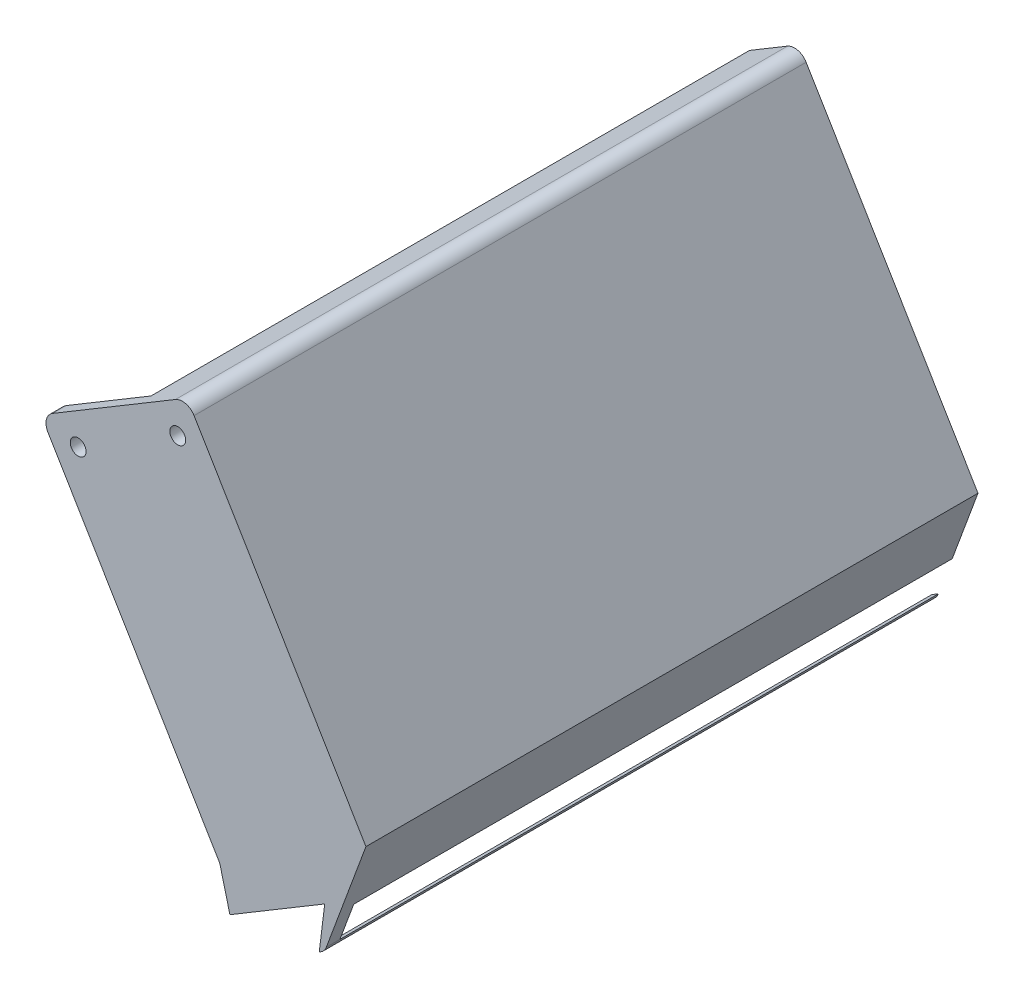
ISO-10303-21;
HEADER;
FILE_DESCRIPTION(('STEP AP214'),'2;1');
FILE_NAME('part.step','',(''),(''),'','','');
FILE_SCHEMA(('AUTOMOTIVE_DESIGN { 1 0 10303 214 1 1 1 1 }'));
ENDSEC;
DATA;
#1=APPLICATION_CONTEXT('core data for automotive mechanical design processes');
#2=APPLICATION_PROTOCOL_DEFINITION('international standard','automotive_design',2000,#1);
#3=PRODUCT_CONTEXT('',#1,'mechanical');
#4=PRODUCT('Part','Part','',(#3));
#5=PRODUCT_RELATED_PRODUCT_CATEGORY('part','',(#4));
#6=PRODUCT_DEFINITION_FORMATION('','',#4);
#7=PRODUCT_DEFINITION_CONTEXT('part definition',#1,'design');
#8=PRODUCT_DEFINITION('design','',#6,#7);
#9=PRODUCT_DEFINITION_SHAPE('','',#8);
#10=(LENGTH_UNIT() NAMED_UNIT(*) SI_UNIT(.MILLI.,.METRE.));
#11=(NAMED_UNIT(*) PLANE_ANGLE_UNIT() SI_UNIT($,.RADIAN.));
#12=(NAMED_UNIT(*) SI_UNIT($,.STERADIAN.) SOLID_ANGLE_UNIT());
#13=UNCERTAINTY_MEASURE_WITH_UNIT(LENGTH_MEASURE(1.E-05),#10,'distance_accuracy_value','');
#14=(GEOMETRIC_REPRESENTATION_CONTEXT(3) GLOBAL_UNCERTAINTY_ASSIGNED_CONTEXT((#13)) GLOBAL_UNIT_ASSIGNED_CONTEXT((#10,
#11,#12)) REPRESENTATION_CONTEXT('',''));
#15=CARTESIAN_POINT('',(0.,0.,0.));
#16=DIRECTION('',(0.,0.,1.));
#17=DIRECTION('',(1.,0.,0.));
#18=AXIS2_PLACEMENT_3D('',#15,#16,#17);
#19=CARTESIAN_POINT('',(0.,0.,0.));
#20=DIRECTION('',(0.,0.,1.));
#21=DIRECTION('',(1.,0.,0.));
#22=AXIS2_PLACEMENT_3D('',#19,#20,#21);
#23=PLANE('',#22);
#24=DIRECTION('',(-0.122168218425157,-0.992509408724584,0.));
#25=VECTOR('',#24,1.);
#26=CARTESIAN_POINT('',(-24.1589217394589,2.97372740453434,0.));
#27=LINE('',#26,#25);
#28=CARTESIAN_POINT('',(-18.5911401472742,48.2070596672311,0.));
#29=VERTEX_POINT('',#28);
#30=CARTESIAN_POINT('',(-18.6908477215663,47.3970232528373,0.));
#31=VERTEX_POINT('',#30);
#32=EDGE_CURVE('E155',#29,#31,#27,.T.);
#33=ORIENTED_EDGE('',*,*,#32,.F.);
#34=DIRECTION('',(0.85819225027226,0.513328414928139,0.));
#35=VECTOR('',#34,1.);
#36=CARTESIAN_POINT('',(-26.1357494823267,43.6942452599861,0.));
#37=LINE('',#36,#35);
#38=CARTESIAN_POINT('',(-17.1299721020068,49.0810585601164,0.));
#39=VERTEX_POINT('',#38);
#40=EDGE_CURVE('E287',#29,#39,#37,.T.);
#41=ORIENTED_EDGE('',*,*,#40,.T.);
#42=CARTESIAN_POINT('',(-19.9431684758562,50.1231363701482,0.));
#43=DIRECTION('',(0.,0.,1.));
#44=DIRECTION('',(1.,0.,0.));
#45=AXIS2_PLACEMENT_3D('',#42,#43,#44);
#46=CIRCLE('',#45,3.);
#47=EDGE_CURVE('E158',#31,#39,#46,.T.);
#48=ORIENTED_EDGE('',*,*,#47,.F.);
#49=EDGE_LOOP('',(#33,#41,#48));
#50=FACE_BOUND('',#49,.T.);
#51=ADVANCED_FACE('F41',(#50),#23,.F.);
#52=CARTESIAN_POINT('',(-49.9700560209885,130.572534582023,252.162501477807));
#53=DIRECTION('',(0.,0.,-1.));
#54=DIRECTION('',(-1.,0.,0.));
#55=AXIS2_PLACEMENT_3D('',#52,#53,#54);
#56=CYLINDRICAL_SURFACE('',#55,1.75);
#57=CARTESIAN_POINT('',(-49.9700560209885,130.572534582023,135.29379279844));
#58=DIRECTION('',(-5.48544119584451E-13,9.16846114590286E-13,-1.));
#59=DIRECTION('',(0.,1.,9.16846114590286E-13));
#60=AXIS2_PLACEMENT_3D('',#57,#58,#59);
#61=CIRCLE('',#60,1.75);
#62=CARTESIAN_POINT('',(-49.9700560209885,132.322534582023,135.293792798442));
#63=VERTEX_POINT('',#62);
#64=EDGE_CURVE('E141',#63,#63,#61,.T.);
#65=ORIENTED_EDGE('',*,*,#64,.F.);
#66=EDGE_LOOP('',(#65));
#67=FACE_BOUND('',#66,.T.);
#68=CARTESIAN_POINT('',(-49.9700560209885,130.572534582023,0.));
#69=DIRECTION('',(0.,0.,1.));
#70=DIRECTION('',(1.,0.,0.));
#71=AXIS2_PLACEMENT_3D('',#68,#69,#70);
#72=CIRCLE('',#71,1.75);
#73=CARTESIAN_POINT('',(-48.2200560209885,130.572534582023,0.));
#74=VERTEX_POINT('',#73);
#75=EDGE_CURVE('E148',#74,#74,#72,.T.);
#76=ORIENTED_EDGE('',*,*,#75,.F.);
#77=EDGE_LOOP('',(#76));
#78=FACE_BOUND('',#77,.T.);
#79=ADVANCED_FACE('F315',(#67,#78),#56,.F.);
#80=CARTESIAN_POINT('',(-71.983811387942,117.404597068063,252.162501477807));
#81=DIRECTION('',(0.,0.,-1.));
#82=DIRECTION('',(-1.,0.,0.));
#83=AXIS2_PLACEMENT_3D('',#80,#81,#82);
#84=CYLINDRICAL_SURFACE('',#83,1.74999999999394);
#85=CARTESIAN_POINT('',(-71.983811387942,117.404597068063,132.293792798428));
#86=DIRECTION('',(0.,0.,1.));
#87=DIRECTION('',(0.,-1.,0.));
#88=AXIS2_PLACEMENT_3D('',#85,#86,#87);
#89=CIRCLE('',#88,1.74999999999394);
#90=CARTESIAN_POINT('',(-71.983811387942,115.654597068069,132.293792798428));
#91=VERTEX_POINT('',#90);
#92=EDGE_CURVE('E273',#91,#91,#89,.T.);
#93=ORIENTED_EDGE('',*,*,#92,.F.);
#94=EDGE_LOOP('',(#93));
#95=FACE_BOUND('',#94,.T.);
#96=CARTESIAN_POINT('',(-71.983811387942,117.404597068063,135.29379279844));
#97=DIRECTION('',(-5.48544119584451E-13,9.16846114590286E-13,-1.));
#98=DIRECTION('',(0.,1.,9.16846114590286E-13));
#99=AXIS2_PLACEMENT_3D('',#96,#97,#98);
#100=CIRCLE('',#99,1.74999999999394);
#101=CARTESIAN_POINT('',(-71.983811387942,119.154597068057,135.293792798442));
#102=VERTEX_POINT('',#101);
#103=EDGE_CURVE('E142',#102,#102,#100,.T.);
#104=ORIENTED_EDGE('',*,*,#103,.F.);
#105=EDGE_LOOP('',(#104));
#106=FACE_BOUND('',#105,.T.);
#107=ADVANCED_FACE('F43',(#95,#106),#84,.F.);
#108=ORIENTED_EDGE('',*,*,#75,.T.);
#109=EDGE_LOOP('',(#108));
#110=FACE_BOUND('',#109,.T.);
#111=DIRECTION('',(-0.347359270010605,-0.93773212461646,0.));
#112=VECTOR('',#111,1.);
#113=CARTESIAN_POINT('',(-31.0502665739293,11.5017899543179,0.));
#114=LINE('',#113,#112);
#115=CARTESIAN_POINT('',(-8.37331814381061,72.7205477854932,0.));
#116=VERTEX_POINT('',#115);
#117=CARTESIAN_POINT('',(-14.0762914229905,57.3247840577743,0.));
#118=VERTEX_POINT('',#117);
#119=EDGE_CURVE('E161',#116,#118,#114,.T.);
#120=ORIENTED_EDGE('',*,*,#119,.T.);
#121=DIRECTION('',(-0.513328414928139,0.85819225027226,0.));
#122=VECTOR('',#121,1.);
#123=CARTESIAN_POINT('',(14.8864399129308,8.90433653065903,0.));
#124=LINE('',#123,#122);
#125=CARTESIAN_POINT('',(-58.8825995643649,132.232825950646,0.));
#126=VERTEX_POINT('',#125);
#127=EDGE_CURVE('E253',#118,#126,#124,.T.);
#128=ORIENTED_EDGE('',*,*,#127,.T.);
#129=DIRECTION('',(-0.858185530746527,-0.513339648592724,0.));
#130=VECTOR('',#129,1.);
#131=CARTESIAN_POINT('',(-73.7705372705339,123.327328903047,0.));
#132=LINE('',#131,#130);
#133=CARTESIAN_POINT('',(-50.4755373203077,137.261666712279,0.));
#134=VERTEX_POINT('',#133);
#135=EDGE_CURVE('E151',#134,#126,#132,.T.);
#136=ORIENTED_EDGE('',*,*,#135,.F.);
#137=CARTESIAN_POINT('',(-48.9355183745295,134.687110120039,0.));
#138=DIRECTION('',(0.,0.,1.));
#139=DIRECTION('',(1.,0.,0.));
#140=AXIS2_PLACEMENT_3D('',#137,#138,#139);
#141=CIRCLE('',#140,3.);
#142=CARTESIAN_POINT('',(-46.3609617822885,136.227129065815,0.));
#143=VERTEX_POINT('',#142);
#144=EDGE_CURVE('E167',#143,#134,#141,.T.);
#145=ORIENTED_EDGE('',*,*,#144,.F.);
#146=DIRECTION('',(-0.513339648591929,0.858185530747003,0.));
#147=VECTOR('',#146,1.);
#148=CARTESIAN_POINT('',(25.8695565423683,15.4743567549187,0.));
#149=LINE('',#148,#147);
#150=EDGE_CURVE('E164',#116,#143,#149,.T.);
#151=ORIENTED_EDGE('',*,*,#150,.F.);
#152=EDGE_LOOP('',(#120,#128,#136,#145,#151));
#153=FACE_BOUND('',#152,.T.);
#154=ADVANCED_FACE('F249',(#110,#153),#23,.F.);
#155=CARTESIAN_POINT('',(-48.9355183745295,134.687110120039,252.162501477807));
#156=DIRECTION('',(0.,0.,-1.));
#157=DIRECTION('',(-1.,0.,0.));
#158=AXIS2_PLACEMENT_3D('',#155,#156,#157);
#159=CYLINDRICAL_SURFACE('',#158,3.);
#160=DIRECTION('',(0.,0.,-1.));
#161=VECTOR('',#160,1.);
#162=CARTESIAN_POINT('',(-50.4755373203077,137.261666712279,252.162501477807));
#163=LINE('',#162,#161);
#164=CARTESIAN_POINT('',(-50.4755373203077,137.261666712279,135.293792798446));
#165=VERTEX_POINT('',#164);
#166=EDGE_CURVE('E170',#165,#134,#163,.T.);
#167=ORIENTED_EDGE('',*,*,#166,.F.);
#168=CARTESIAN_POINT('',(-48.9355183745295,134.687110120039,135.293792798443));
#169=DIRECTION('',(-5.48544119584451E-13,9.16846114590286E-13,-1.));
#170=DIRECTION('',(0.,1.,9.16846114590286E-13));
#171=AXIS2_PLACEMENT_3D('',#168,#169,#170);
#172=CIRCLE('',#171,3.);
#173=CARTESIAN_POINT('',(-46.3609617822885,136.227129065815,135.293792798446));
#174=VERTEX_POINT('',#173);
#175=EDGE_CURVE('E195',#165,#174,#172,.T.);
#176=ORIENTED_EDGE('',*,*,#175,.T.);
#177=DIRECTION('',(0.,0.,-1.));
#178=VECTOR('',#177,1.);
#179=CARTESIAN_POINT('',(-46.3609617822885,136.227129065815,252.162501477807));
#180=LINE('',#179,#178);
#181=EDGE_CURVE('E172',#174,#143,#180,.T.);
#182=ORIENTED_EDGE('',*,*,#181,.T.);
#183=ORIENTED_EDGE('',*,*,#144,.T.);
#184=EDGE_LOOP('',(#167,#176,#182,#183));
#185=FACE_BOUND('',#184,.T.);
#186=ADVANCED_FACE('F240',(#185),#159,.T.);
#187=CARTESIAN_POINT('',(25.8695565423683,15.4743567549187,252.162501477807));
#188=DIRECTION('',(-0.858185530747003,-0.513339648591929,0.));
#189=DIRECTION('',(0.513339648591929,-0.858185530747003,0.));
#190=AXIS2_PLACEMENT_3D('',#187,#188,#189);
#191=PLANE('',#190);
#192=ORIENTED_EDGE('',*,*,#181,.F.);
#193=DIRECTION('',(0.513339648591929,-0.858185530747003,-1.06841351504764E-12));
#194=VECTOR('',#193,1.);
#195=CARTESIAN_POINT('',(25.8695565423042,15.4743567550259,135.293792798293));
#196=LINE('',#195,#194);
#197=CARTESIAN_POINT('',(-8.37331814381062,72.7205477854932,135.293792798364));
#198=VERTEX_POINT('',#197);
#199=EDGE_CURVE('E84',#174,#198,#196,.T.);
#200=ORIENTED_EDGE('',*,*,#199,.T.);
#201=DIRECTION('',(0.,0.,-1.));
#202=VECTOR('',#201,1.);
#203=CARTESIAN_POINT('',(-8.37331814381061,72.7205477854932,252.162501477807));
#204=LINE('',#203,#202);
#205=EDGE_CURVE('E175',#198,#116,#204,.T.);
#206=ORIENTED_EDGE('',*,*,#205,.T.);
#207=ORIENTED_EDGE('',*,*,#150,.T.);
#208=EDGE_LOOP('',(#192,#200,#206,#207));
#209=FACE_BOUND('',#208,.T.);
#210=ADVANCED_FACE('F245',(#209),#191,.F.);
#211=CARTESIAN_POINT('',(-31.0502665739293,11.5017899543179,252.162501477807));
#212=DIRECTION('',(0.93773212461646,-0.347359270010605,0.));
#213=DIRECTION('',(0.347359270010605,0.93773212461646,0.));
#214=AXIS2_PLACEMENT_3D('',#211,#212,#213);
#215=PLANE('',#214);
#216=DIRECTION('',(-0.347359270010605,-0.93773212461646,0.));
#217=VECTOR('',#216,1.);
#218=CARTESIAN_POINT('',(-31.0502665739293,11.5017899543179,132.293792798428));
#219=LINE('',#218,#217);
#220=CARTESIAN_POINT('',(-14.0762914229905,57.3247840577743,132.293792798428));
#221=VERTEX_POINT('',#220);
#222=CARTESIAN_POINT('',(-17.1299721020069,49.0810585601163,132.293792798428));
#223=VERTEX_POINT('',#222);
#224=EDGE_CURVE('E266',#221,#223,#219,.T.);
#225=ORIENTED_EDGE('',*,*,#224,.F.);
#226=DIRECTION('',(0.,0.,1.));
#227=VECTOR('',#226,1.);
#228=CARTESIAN_POINT('',(-14.0762914229905,57.3247840577743,252.162501477807));
#229=LINE('',#228,#227);
#230=EDGE_CURVE('E354',#118,#221,#229,.T.);
#231=ORIENTED_EDGE('',*,*,#230,.F.);
#232=ORIENTED_EDGE('',*,*,#119,.F.);
#233=ORIENTED_EDGE('',*,*,#205,.F.);
#234=DIRECTION('',(0.347359270010605,0.93773212461646,6.6921417003363E-13));
#235=VECTOR('',#234,1.);
#236=CARTESIAN_POINT('',(-31.0502665739021,11.5017899543913,135.293792798321));
#237=LINE('',#236,#235);
#238=CARTESIAN_POINT('',(-17.1299721020068,49.0810585601164,135.293792798347));
#239=VERTEX_POINT('',#238);
#240=EDGE_CURVE('E290',#239,#198,#237,.T.);
#241=ORIENTED_EDGE('',*,*,#240,.F.);
#242=DIRECTION('',(0.,0.,-1.));
#243=VECTOR('',#242,1.);
#244=CARTESIAN_POINT('',(-17.1299721020068,49.0810585601164,252.162501477807));
#245=LINE('',#244,#243);
#246=EDGE_CURVE('E178',#239,#223,#245,.T.);
#247=ORIENTED_EDGE('',*,*,#246,.T.);
#248=EDGE_LOOP('',(#225,#231,#232,#233,#241,#247));
#249=FACE_BOUND('',#248,.T.);
#250=ADVANCED_FACE('F289',(#249),#215,.T.);
#251=CARTESIAN_POINT('',(-19.9431684758562,50.1231363701482,252.162501477807));
#252=DIRECTION('',(0.,0.,-1.));
#253=DIRECTION('',(-1.,0.,0.));
#254=AXIS2_PLACEMENT_3D('',#251,#252,#253);
#255=CYLINDRICAL_SURFACE('',#254,3.);
#256=ORIENTED_EDGE('',*,*,#246,.F.);
#257=CARTESIAN_POINT('',(-19.9431684758562,50.1231363701482,135.29379279835));
#258=DIRECTION('',(-5.48544119584451E-13,9.16846114590286E-13,-1.));
#259=DIRECTION('',(0.,1.,9.16846114590286E-13));
#260=AXIS2_PLACEMENT_3D('',#257,#258,#259);
#261=CIRCLE('',#260,3.);
#262=CARTESIAN_POINT('',(-18.6908477215663,47.3970232528373,135.293792798347));
#263=VERTEX_POINT('',#262);
#264=EDGE_CURVE('E291',#239,#263,#261,.T.);
#265=ORIENTED_EDGE('',*,*,#264,.T.);
#266=DIRECTION('',(0.,0.,-1.));
#267=VECTOR('',#266,1.);
#268=CARTESIAN_POINT('',(-18.6908477215663,47.3970232528373,252.162501477807));
#269=LINE('',#268,#267);
#270=EDGE_CURVE('E181',#263,#31,#269,.T.);
#271=ORIENTED_EDGE('',*,*,#270,.T.);
#272=ORIENTED_EDGE('',*,*,#47,.T.);
#273=DIRECTION('',(0.,0.,-1.));
#274=VECTOR('',#273,1.);
#275=CARTESIAN_POINT('',(-17.1299721020068,49.0810585601163,252.162501477807));
#276=LINE('',#275,#274);
#277=EDGE_CURVE('E152',#39,#223,#276,.F.);
#278=ORIENTED_EDGE('',*,*,#277,.T.);
#279=EDGE_LOOP('',(#256,#265,#271,#272,#278));
#280=FACE_BOUND('',#279,.T.);
#281=ADVANCED_FACE('F283',(#280),#255,.T.);
#282=CARTESIAN_POINT('',(-24.1589217394589,2.97372740453434,252.162501477807));
#283=DIRECTION('',(0.992509408724584,-0.122168218425156,0.));
#284=DIRECTION('',(0.122168218425157,0.992509408724584,0.));
#285=AXIS2_PLACEMENT_3D('',#282,#283,#284);
#286=PLANE('',#285);
#287=DIRECTION('',(0.,0.,-1.));
#288=VECTOR('',#287,1.);
#289=CARTESIAN_POINT('',(-17.4864454877962,57.1817329286847,252.162501477807));
#290=LINE('',#289,#288);
#291=CARTESIAN_POINT('',(-17.4864454877962,57.1817329286847,135.293792798355));
#292=VERTEX_POINT('',#291);
#293=CARTESIAN_POINT('',(-17.4864454877962,57.1817329286847,132.293792798428));
#294=VERTEX_POINT('',#293);
#295=EDGE_CURVE('E184',#292,#294,#290,.T.);
#296=ORIENTED_EDGE('',*,*,#295,.T.);
#297=DIRECTION('',(-0.122168218425157,-0.992509408724584,0.));
#298=VECTOR('',#297,1.);
#299=CARTESIAN_POINT('',(-24.1589217394589,2.97372740453437,132.293792798428));
#300=LINE('',#299,#298);
#301=CARTESIAN_POINT('',(-18.5911401472742,48.207059667231,132.293792798428));
#302=VERTEX_POINT('',#301);
#303=EDGE_CURVE('E274',#294,#302,#300,.T.);
#304=ORIENTED_EDGE('',*,*,#303,.T.);
#305=DIRECTION('',(0.,0.,-1.));
#306=VECTOR('',#305,1.);
#307=CARTESIAN_POINT('',(-18.5911401472742,48.207059667231,252.162501477807));
#308=LINE('',#307,#306);
#309=EDGE_CURVE('E11',#302,#29,#308,.T.);
#310=ORIENTED_EDGE('',*,*,#309,.T.);
#311=ORIENTED_EDGE('',*,*,#32,.T.);
#312=ORIENTED_EDGE('',*,*,#270,.F.);
#313=DIRECTION('',(0.122168218425157,0.992509408724584,8.42963737266209E-13));
#314=VECTOR('',#313,1.);
#315=CARTESIAN_POINT('',(-24.1589217394468,2.97372740463212,135.293792798309));
#316=LINE('',#315,#314);
#317=EDGE_CURVE('E134',#263,#292,#316,.T.);
#318=ORIENTED_EDGE('',*,*,#317,.T.);
#319=EDGE_LOOP('',(#296,#304,#310,#311,#312,#318));
#320=FACE_BOUND('',#319,.T.);
#321=ADVANCED_FACE('F298',(#320),#286,.F.);
#322=CARTESIAN_POINT('',(-29.7983086499103,49.8173816428101,252.162501477807));
#323=DIRECTION('',(-0.513328414928139,0.85819225027226,0.));
#324=DIRECTION('',(-0.85819225027226,-0.513328414928139,0.));
#325=AXIS2_PLACEMENT_3D('',#322,#323,#324);
#326=PLANE('',#325);
#327=DIRECTION('',(0.,0.,-1.));
#328=VECTOR('',#327,1.);
#329=CARTESIAN_POINT('',(-38.4404332045219,44.6480875856534,252.162501477807));
#330=LINE('',#329,#328);
#331=CARTESIAN_POINT('',(-38.4404332045219,44.6480875856534,135.293792798355));
#332=VERTEX_POINT('',#331);
#333=CARTESIAN_POINT('',(-38.4404332045219,44.6480875856534,132.293792798428));
#334=VERTEX_POINT('',#333);
#335=EDGE_CURVE('E127',#332,#334,#330,.T.);
#336=ORIENTED_EDGE('',*,*,#335,.T.);
#337=DIRECTION('',(0.85819225027226,0.513328414928139,0.));
#338=VECTOR('',#337,1.);
#339=CARTESIAN_POINT('',(-29.7983086499103,49.8173816428101,132.293792798428));
#340=LINE('',#339,#338);
#341=EDGE_CURVE('E303',#334,#294,#340,.T.);
#342=ORIENTED_EDGE('',*,*,#341,.T.);
#343=ORIENTED_EDGE('',*,*,#295,.F.);
#344=DIRECTION('',(-0.85819225027226,-0.513328414928139,0.));
#345=VECTOR('',#344,1.);
#346=CARTESIAN_POINT('',(-29.7983086499103,49.8173816428101,135.293792798355));
#347=LINE('',#346,#345);
#348=EDGE_CURVE('E132',#292,#332,#347,.T.);
#349=ORIENTED_EDGE('',*,*,#348,.T.);
#350=EDGE_LOOP('',(#336,#342,#343,#349));
#351=FACE_BOUND('',#350,.T.);
#352=ADVANCED_FACE('F302',(#351),#326,.F.);
#353=CARTESIAN_POINT('',(-25.3103448536569,-6.49764934590859,252.162501477807));
#354=DIRECTION('',(-0.968591850168242,-0.248656043135215,0.));
#355=DIRECTION('',(0.248656043135215,-0.968591850168242,0.));
#356=AXIS2_PLACEMENT_3D('',#353,#354,#355);
#357=PLANE('',#356);
#358=DIRECTION('',(-0.248656043135215,0.968591850168242,0.));
#359=VECTOR('',#358,1.);
#360=CARTESIAN_POINT('',(-25.3103448536569,-6.49764934590856,132.293792798428));
#361=LINE('',#360,#359);
#362=CARTESIAN_POINT('',(-40.5772158098123,52.9715137568811,132.293792798428));
#363=VERTEX_POINT('',#362);
#364=EDGE_CURVE('E304',#334,#363,#361,.T.);
#365=ORIENTED_EDGE('',*,*,#364,.F.);
#366=ORIENTED_EDGE('',*,*,#335,.F.);
#367=DIRECTION('',(0.248656043135215,-0.968591850168242,-1.02444848471153E-12));
#368=VECTOR('',#367,1.);
#369=CARTESIAN_POINT('',(-25.3103448536866,-6.49764934579262,135.293792798301));
#370=LINE('',#369,#368);
#371=CARTESIAN_POINT('',(-40.5772158098123,52.9715137568811,135.293792798364));
#372=VERTEX_POINT('',#371);
#373=EDGE_CURVE('E109',#372,#332,#370,.T.);
#374=ORIENTED_EDGE('',*,*,#373,.F.);
#375=DIRECTION('',(0.,0.,-1.));
#376=VECTOR('',#375,1.);
#377=CARTESIAN_POINT('',(-40.5772158098123,52.9715137568811,252.162501477807));
#378=LINE('',#377,#376);
#379=EDGE_CURVE('E119',#372,#363,#378,.T.);
#380=ORIENTED_EDGE('',*,*,#379,.T.);
#381=EDGE_LOOP('',(#365,#366,#374,#380));
#382=FACE_BOUND('',#381,.T.);
#383=ADVANCED_FACE('F129',(#382),#357,.T.);
#384=CARTESIAN_POINT('',(-43.4829913603171,52.2255456274755,252.162501477807));
#385=DIRECTION('',(0.,0.,-1.));
#386=DIRECTION('',(-1.,0.,0.));
#387=AXIS2_PLACEMENT_3D('',#384,#385,#386);
#388=CYLINDRICAL_SURFACE('',#387,3.);
#389=DIRECTION('',(0.,0.,-1.));
#390=VECTOR('',#389,1.);
#391=CARTESIAN_POINT('',(-40.9084347680775,53.7655645732536,252.162501477807));
#392=LINE('',#391,#390);
#393=CARTESIAN_POINT('',(-40.9084347680775,53.7655645732536,135.293792798365));
#394=VERTEX_POINT('',#393);
#395=CARTESIAN_POINT('',(-40.9084347680775,53.7655645732536,132.293792798428));
#396=VERTEX_POINT('',#395);
#397=EDGE_CURVE('E126',#394,#396,#392,.T.);
#398=ORIENTED_EDGE('',*,*,#397,.T.);
#399=CARTESIAN_POINT('',(-43.4829913603171,52.2255456274755,132.293792798428));
#400=DIRECTION('',(0.,0.,1.));
#401=DIRECTION('',(0.,-1.,0.));
#402=AXIS2_PLACEMENT_3D('',#399,#400,#401);
#403=CIRCLE('',#402,3.);
#404=EDGE_CURVE('E123',#396,#363,#403,.F.);
#405=ORIENTED_EDGE('',*,*,#404,.T.);
#406=ORIENTED_EDGE('',*,*,#379,.F.);
#407=CARTESIAN_POINT('',(-43.4829913603171,52.2255456274755,135.293792798365));
#408=DIRECTION('',(-5.48544119584451E-13,9.16846114590286E-13,-1.));
#409=DIRECTION('',(0.,1.,9.16846114590286E-13));
#410=AXIS2_PLACEMENT_3D('',#407,#408,#409);
#411=CIRCLE('',#410,3.);
#412=EDGE_CURVE('E105',#372,#394,#411,.F.);
#413=ORIENTED_EDGE('',*,*,#412,.T.);
#414=EDGE_LOOP('',(#398,#405,#406,#413));
#415=FACE_BOUND('',#414,.T.);
#416=ADVANCED_FACE('F120',(#415),#388,.F.);
#417=CARTESIAN_POINT('',(-6.44242519343134,-3.85365654208141,252.162501477807));
#418=DIRECTION('',(0.858185530746527,0.513339648592725,0.));
#419=DIRECTION('',(-0.513339648592725,0.858185530746527,0.));
#420=AXIS2_PLACEMENT_3D('',#417,#418,#419);
#421=PLANE('',#420);
#422=DIRECTION('',(0.,0.,-1.));
#423=VECTOR('',#422,1.);
#424=CARTESIAN_POINT('',(-78.6729435181871,116.899115768726,252.162501477807));
#425=LINE('',#424,#423);
#426=CARTESIAN_POINT('',(-78.6729435181871,116.899115768726,135.293792798443));
#427=VERTEX_POINT('',#426);
#428=CARTESIAN_POINT('',(-78.6729435181871,116.899115768726,132.293792798428));
#429=VERTEX_POINT('',#428);
#430=EDGE_CURVE('E189',#427,#429,#425,.T.);
#431=ORIENTED_EDGE('',*,*,#430,.T.);
#432=DIRECTION('',(0.513339648592725,-0.858185530746527,0.));
#433=VECTOR('',#432,1.);
#434=CARTESIAN_POINT('',(-6.44242519343135,-3.85365654208138,132.293792798428));
#435=LINE('',#434,#433);
#436=EDGE_CURVE('E217',#429,#396,#435,.T.);
#437=ORIENTED_EDGE('',*,*,#436,.T.);
#438=ORIENTED_EDGE('',*,*,#397,.F.);
#439=DIRECTION('',(-0.513339648592725,0.858185530746527,1.06841351504764E-12));
#440=VECTOR('',#439,1.);
#441=CARTESIAN_POINT('',(-6.44242519349543,-3.85365654197425,135.293792798293));
#442=LINE('',#441,#440);
#443=EDGE_CURVE('E112',#394,#427,#442,.T.);
#444=ORIENTED_EDGE('',*,*,#443,.T.);
#445=EDGE_LOOP('',(#431,#437,#438,#444));
#446=FACE_BOUND('',#445,.T.);
#447=ADVANCED_FACE('F214',(#446),#421,.F.);
#448=CARTESIAN_POINT('',(-76.0983869259475,118.439134714504,252.162501477807));
#449=DIRECTION('',(0.,0.,-1.));
#450=DIRECTION('',(-1.,0.,0.));
#451=AXIS2_PLACEMENT_3D('',#448,#449,#450);
#452=CYLINDRICAL_SURFACE('',#451,3.);
#453=DIRECTION('',(0.,0.,-1.));
#454=VECTOR('',#453,1.);
#455=CARTESIAN_POINT('',(-77.6384058717257,121.013691306744,252.162501477807));
#456=LINE('',#455,#454);
#457=CARTESIAN_POINT('',(-77.6384058717257,121.013691306744,135.293792798446));
#458=VERTEX_POINT('',#457);
#459=CARTESIAN_POINT('',(-77.6384058717257,121.013691306744,132.293792798428));
#460=VERTEX_POINT('',#459);
#461=EDGE_CURVE('E192',#458,#460,#456,.T.);
#462=ORIENTED_EDGE('',*,*,#461,.T.);
#463=CARTESIAN_POINT('',(-76.0983869259475,118.439134714504,132.293792798428));
#464=DIRECTION('',(0.,0.,1.));
#465=DIRECTION('',(0.,-1.,0.));
#466=AXIS2_PLACEMENT_3D('',#463,#464,#465);
#467=CIRCLE('',#466,3.);
#468=EDGE_CURVE('E211',#460,#429,#467,.T.);
#469=ORIENTED_EDGE('',*,*,#468,.T.);
#470=ORIENTED_EDGE('',*,*,#430,.F.);
#471=CARTESIAN_POINT('',(-76.0983869259475,118.439134714504,135.293792798443));
#472=DIRECTION('',(-5.48544119584451E-13,9.16846114590286E-13,-1.));
#473=DIRECTION('',(0.,1.,9.16846114590286E-13));
#474=AXIS2_PLACEMENT_3D('',#471,#472,#473);
#475=CIRCLE('',#474,3.);
#476=EDGE_CURVE('E65',#427,#458,#475,.T.);
#477=ORIENTED_EDGE('',*,*,#476,.T.);
#478=EDGE_LOOP('',(#462,#469,#470,#477));
#479=FACE_BOUND('',#478,.T.);
#480=ADVANCED_FACE('F210',(#479),#452,.T.);
#481=CARTESIAN_POINT('',(-73.7705372705339,123.327328903047,252.162501477807));
#482=DIRECTION('',(0.513339648592724,-0.858185530746527,0.));
#483=DIRECTION('',(0.858185530746527,0.513339648592724,0.));
#484=AXIS2_PLACEMENT_3D('',#481,#482,#483);
#485=PLANE('',#484);
#486=DIRECTION('',(0.,0.,1.));
#487=VECTOR('',#486,1.);
#488=CARTESIAN_POINT('',(-58.8825995643649,132.232825950646,252.162501477807));
#489=LINE('',#488,#487);
#490=CARTESIAN_POINT('',(-58.8825995643649,132.232825950646,132.293792798428));
#491=VERTEX_POINT('',#490);
#492=EDGE_CURVE('E145',#126,#491,#489,.T.);
#493=ORIENTED_EDGE('',*,*,#492,.T.);
#494=DIRECTION('',(-0.858185530746527,-0.513339648592724,0.));
#495=VECTOR('',#494,1.);
#496=CARTESIAN_POINT('',(-73.7705372705339,123.327328903047,132.293792798428));
#497=LINE('',#496,#495);
#498=EDGE_CURVE('E49',#491,#460,#497,.T.);
#499=ORIENTED_EDGE('',*,*,#498,.T.);
#500=ORIENTED_EDGE('',*,*,#461,.F.);
#501=DIRECTION('',(0.858185530746527,0.513339648592724,0.));
#502=VECTOR('',#501,1.);
#503=CARTESIAN_POINT('',(-73.7705372705339,123.327328903047,135.293792798447));
#504=LINE('',#503,#502);
#505=EDGE_CURVE('E75',#458,#165,#504,.T.);
#506=ORIENTED_EDGE('',*,*,#505,.T.);
#507=ORIENTED_EDGE('',*,*,#166,.T.);
#508=ORIENTED_EDGE('',*,*,#135,.T.);
#509=EDGE_LOOP('',(#493,#499,#500,#506,#507,#508));
#510=FACE_BOUND('',#509,.T.);
#511=ADVANCED_FACE('F202',(#510),#485,.F.);
#512=CARTESIAN_POINT('',(-35.6929485105728,55.137096870131,135.293792798363));
#513=DIRECTION('',(-5.48544119584451E-13,9.16846114590286E-13,-1.));
#514=DIRECTION('',(0.88108131756069,-0.472964810367028,-9.16947924346578E-13));
#515=AXIS2_PLACEMENT_3D('',#512,#513,#514);
#516=PLANE('',#515);
#517=ORIENTED_EDGE('',*,*,#64,.T.);
#518=EDGE_LOOP('',(#517));
#519=FACE_BOUND('',#518,.T.);
#520=ORIENTED_EDGE('',*,*,#103,.T.);
#521=EDGE_LOOP('',(#520));
#522=FACE_BOUND('',#521,.T.);
#523=ORIENTED_EDGE('',*,*,#476,.F.);
#524=ORIENTED_EDGE('',*,*,#443,.F.);
#525=ORIENTED_EDGE('',*,*,#412,.F.);
#526=ORIENTED_EDGE('',*,*,#373,.T.);
#527=ORIENTED_EDGE('',*,*,#348,.F.);
#528=ORIENTED_EDGE('',*,*,#317,.F.);
#529=ORIENTED_EDGE('',*,*,#264,.F.);
#530=ORIENTED_EDGE('',*,*,#240,.T.);
#531=ORIENTED_EDGE('',*,*,#199,.F.);
#532=ORIENTED_EDGE('',*,*,#175,.F.);
#533=ORIENTED_EDGE('',*,*,#505,.F.);
#534=EDGE_LOOP('',(#523,#524,#525,#526,#527,#528,#529,#530,#531,#532,#533));
#535=FACE_BOUND('',#534,.T.);
#536=ADVANCED_FACE('F107',(#519,#522,#535),#516,.F.);
#537=CARTESIAN_POINT('',(-64.7222105016286,20.6137212090631,132.293792798428));
#538=DIRECTION('',(0.513328414928139,-0.85819225027226,0.));
#539=DIRECTION('',(0.85819225027226,0.513328414928139,0.));
#540=AXIS2_PLACEMENT_3D('',#537,#538,#539);
#541=PLANE('',#540);
#542=ORIENTED_EDGE('',*,*,#40,.F.);
#543=ORIENTED_EDGE('',*,*,#309,.F.);
#544=DIRECTION('',(0.85819225027226,0.513328414928139,0.));
#545=VECTOR('',#544,1.);
#546=CARTESIAN_POINT('',(-64.7222105016286,20.6137212090631,132.293792798428));
#547=LINE('',#546,#545);
#548=EDGE_CURVE('E269',#302,#223,#547,.T.);
#549=ORIENTED_EDGE('',*,*,#548,.T.);
#550=ORIENTED_EDGE('',*,*,#277,.F.);
#551=EDGE_LOOP('',(#542,#543,#549,#550));
#552=FACE_BOUND('',#551,.T.);
#553=ADVANCED_FACE('F278',(#552),#541,.F.);
#554=CARTESIAN_POINT('',(-112.355566322519,100.248075418096,132.293792798428));
#555=DIRECTION('',(0.,0.,1.));
#556=DIRECTION('',(0.,-1.,0.));
#557=AXIS2_PLACEMENT_3D('',#554,#555,#556);
#558=PLANE('',#557);
#559=ORIENTED_EDGE('',*,*,#92,.T.);
#560=EDGE_LOOP('',(#559));
#561=FACE_BOUND('',#560,.T.);
#562=ORIENTED_EDGE('',*,*,#224,.T.);
#563=ORIENTED_EDGE('',*,*,#548,.F.);
#564=ORIENTED_EDGE('',*,*,#303,.F.);
#565=ORIENTED_EDGE('',*,*,#341,.F.);
#566=ORIENTED_EDGE('',*,*,#364,.T.);
#567=ORIENTED_EDGE('',*,*,#404,.F.);
#568=ORIENTED_EDGE('',*,*,#436,.F.);
#569=ORIENTED_EDGE('',*,*,#468,.F.);
#570=ORIENTED_EDGE('',*,*,#498,.F.);
#571=DIRECTION('',(0.513328414928139,-0.85819225027226,0.));
#572=VECTOR('',#571,1.);
#573=CARTESIAN_POINT('',(-58.8826653902859,132.232935999678,132.293792798428));
#574=LINE('',#573,#572);
#575=EDGE_CURVE('E56',#491,#221,#574,.T.);
#576=ORIENTED_EDGE('',*,*,#575,.T.);
#577=EDGE_LOOP('',(#562,#563,#564,#565,#566,#567,#568,#569,#570,#576));
#578=FACE_BOUND('',#577,.T.);
#579=ADVANCED_FACE('F268',(#561,#578),#558,.F.);
#580=CARTESIAN_POINT('',(14.8864399129308,8.90433653065904,0.));
#581=DIRECTION('',(0.85819225027226,0.513328414928139,0.));
#582=DIRECTION('',(-0.513328414928139,0.85819225027226,0.));
#583=AXIS2_PLACEMENT_3D('',#580,#581,#582);
#584=PLANE('',#583);
#585=ORIENTED_EDGE('',*,*,#230,.T.);
#586=ORIENTED_EDGE('',*,*,#575,.F.);
#587=ORIENTED_EDGE('',*,*,#492,.F.);
#588=ORIENTED_EDGE('',*,*,#127,.F.);
#589=EDGE_LOOP('',(#585,#586,#587,#588));
#590=FACE_BOUND('',#589,.T.);
#591=ADVANCED_FACE('F348',(#590),#584,.F.);
#592=CLOSED_SHELL('',(#51,#79,#107,#154,#186,#210,#250,#281,#321,#352,#383,#416,#447,#480,#511,
#536,#553,#579,#591));
#593=MANIFOLD_SOLID_BREP('B2',#592);
#594=ADVANCED_BREP_SHAPE_REPRESENTATION('',(#18,#593),#14);
#595=SHAPE_DEFINITION_REPRESENTATION(#9,#594);
ENDSEC;
END-ISO-10303-21;
